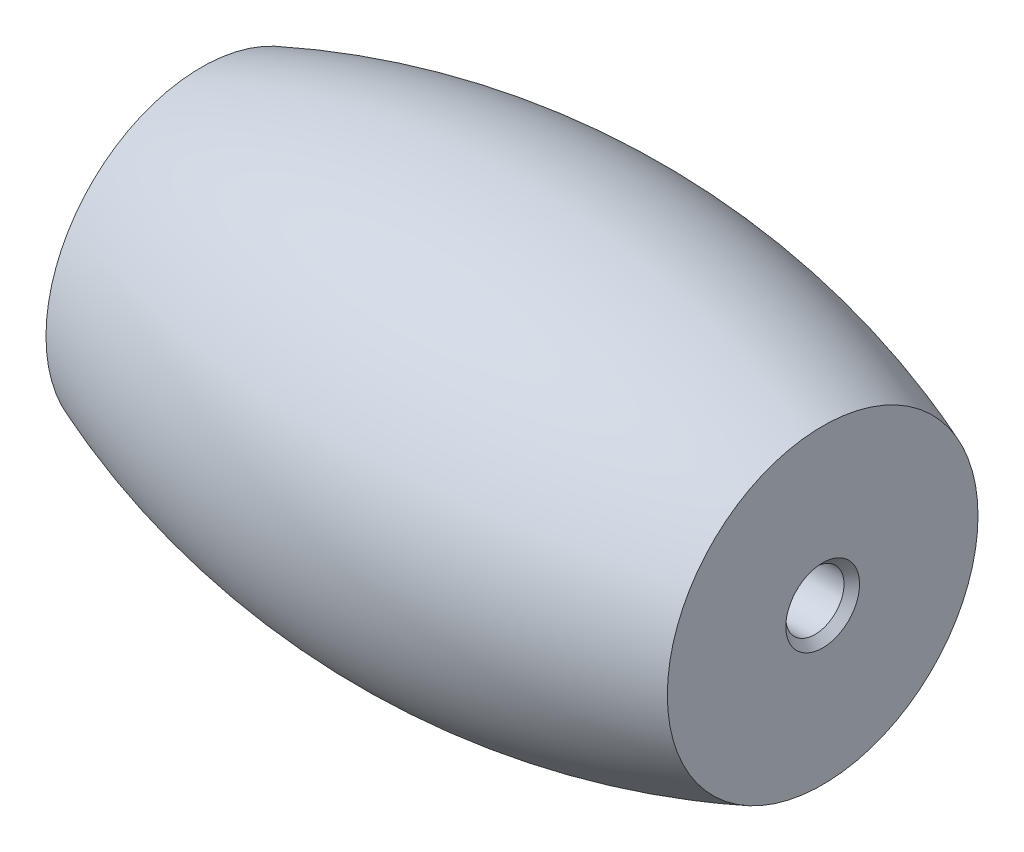
ISO-10303-21;
HEADER;
FILE_DESCRIPTION(('STEP AP214'),'2;1');
FILE_NAME('part.step','',(''),(''),'','','');
FILE_SCHEMA(('AUTOMOTIVE_DESIGN { 1 0 10303 214 1 1 1 1 }'));
ENDSEC;
DATA;
#1=APPLICATION_CONTEXT('core data for automotive mechanical design processes');
#2=APPLICATION_PROTOCOL_DEFINITION('international standard','automotive_design',2000,#1);
#3=PRODUCT_CONTEXT('',#1,'mechanical');
#4=PRODUCT('Part','Part','',(#3));
#5=PRODUCT_RELATED_PRODUCT_CATEGORY('part','',(#4));
#6=PRODUCT_DEFINITION_FORMATION('','',#4);
#7=PRODUCT_DEFINITION_CONTEXT('part definition',#1,'design');
#8=PRODUCT_DEFINITION('design','',#6,#7);
#9=PRODUCT_DEFINITION_SHAPE('','',#8);
#10=(LENGTH_UNIT() NAMED_UNIT(*) SI_UNIT(.MILLI.,.METRE.));
#11=(NAMED_UNIT(*) PLANE_ANGLE_UNIT() SI_UNIT($,.RADIAN.));
#12=(NAMED_UNIT(*) SI_UNIT($,.STERADIAN.) SOLID_ANGLE_UNIT());
#13=UNCERTAINTY_MEASURE_WITH_UNIT(LENGTH_MEASURE(1.E-05),#10,'distance_accuracy_value','');
#14=(GEOMETRIC_REPRESENTATION_CONTEXT(3) GLOBAL_UNCERTAINTY_ASSIGNED_CONTEXT((#13)) GLOBAL_UNIT_ASSIGNED_CONTEXT((#10,
#11,#12)) REPRESENTATION_CONTEXT('',''));
#15=CARTESIAN_POINT('',(0.,0.,0.));
#16=DIRECTION('',(0.,0.,1.));
#17=DIRECTION('',(1.,0.,0.));
#18=AXIS2_PLACEMENT_3D('',#15,#16,#17);
#19=CARTESIAN_POINT('',(0.,16.5797570442413,0.));
#20=DIRECTION('',(-1.,0.,0.));
#21=DIRECTION('',(0.,0.,1.));
#22=AXIS2_PLACEMENT_3D('',#19,#20,#21);
#23=DEGENERATE_TOROIDAL_SURFACE('',#22,16.5797570442413,22.08,.F.);
#24=CARTESIAN_POINT('',(-8.,16.5797570442413,0.));
#25=DIRECTION('',(-1.,0.,0.));
#26=DIRECTION('',(0.,0.,1.));
#27=AXIS2_PLACEMENT_3D('',#24,#25,#26);
#28=CIRCLE('',#27,4.);
#29=CARTESIAN_POINT('',(-8.,16.5797570442413,4.));
#30=VERTEX_POINT('',#29);
#31=EDGE_CURVE('E52',#30,#30,#28,.T.);
#32=ORIENTED_EDGE('',*,*,#31,.F.);
#33=EDGE_LOOP('',(#32));
#34=FACE_BOUND('',#33,.T.);
#35=CARTESIAN_POINT('',(8.,16.5797570442413,0.));
#36=DIRECTION('',(-1.,0.,0.));
#37=DIRECTION('',(0.,0.,1.));
#38=AXIS2_PLACEMENT_3D('',#35,#36,#37);
#39=CIRCLE('',#38,4.);
#40=CARTESIAN_POINT('',(8.,16.5797570442413,4.));
#41=VERTEX_POINT('',#40);
#42=EDGE_CURVE('E55',#41,#41,#39,.T.);
#43=ORIENTED_EDGE('',*,*,#42,.T.);
#44=EDGE_LOOP('',(#43));
#45=FACE_BOUND('',#44,.T.);
#46=ADVANCED_FACE('F32',(#34,#45),#23,.F.);
#47=CARTESIAN_POINT('',(-8.,20.5797570442413,0.));
#48=DIRECTION('',(1.,0.,0.));
#49=DIRECTION('',(0.,0.,-1.));
#50=AXIS2_PLACEMENT_3D('',#47,#48,#49);
#51=PLANE('',#50);
#52=CARTESIAN_POINT('',(-8.,16.5797570442413,0.));
#53=DIRECTION('',(1.,0.,0.));
#54=DIRECTION('',(0.,0.,-1.));
#55=AXIS2_PLACEMENT_3D('',#52,#53,#54);
#56=CIRCLE('',#55,0.95);
#57=CARTESIAN_POINT('',(-8.,16.5797570442413,-0.95));
#58=VERTEX_POINT('',#57);
#59=EDGE_CURVE('E10',#58,#58,#56,.T.);
#60=ORIENTED_EDGE('',*,*,#59,.T.);
#61=EDGE_LOOP('',(#60));
#62=FACE_BOUND('',#61,.T.);
#63=ORIENTED_EDGE('',*,*,#31,.T.);
#64=EDGE_LOOP('',(#63));
#65=FACE_BOUND('',#64,.T.);
#66=ADVANCED_FACE('F63',(#62,#65),#51,.F.);
#67=CARTESIAN_POINT('',(8.,16.5797570442413,0.));
#68=DIRECTION('',(-1.,0.,0.));
#69=DIRECTION('',(0.,0.,1.));
#70=AXIS2_PLACEMENT_3D('',#67,#68,#69);
#71=PLANE('',#70);
#72=CARTESIAN_POINT('',(8.,16.5797570442413,0.));
#73=DIRECTION('',(-1.,0.,0.));
#74=DIRECTION('',(0.,0.,1.));
#75=AXIS2_PLACEMENT_3D('',#72,#73,#74);
#76=CIRCLE('',#75,0.95);
#77=CARTESIAN_POINT('',(8.,16.5797570442413,0.95));
#78=VERTEX_POINT('',#77);
#79=EDGE_CURVE('E39',#78,#78,#76,.T.);
#80=ORIENTED_EDGE('',*,*,#79,.T.);
#81=EDGE_LOOP('',(#80));
#82=FACE_BOUND('',#81,.T.);
#83=ORIENTED_EDGE('',*,*,#42,.F.);
#84=EDGE_LOOP('',(#83));
#85=FACE_BOUND('',#84,.T.);
#86=ADVANCED_FACE('F60',(#82,#85),#71,.F.);
#87=CARTESIAN_POINT('',(10.1213203435596,16.5797570442413,0.));
#88=DIRECTION('',(-1.,0.,0.));
#89=DIRECTION('',(0.,0.,1.));
#90=AXIS2_PLACEMENT_3D('',#87,#88,#89);
#91=CYLINDRICAL_SURFACE('',#90,0.75);
#92=CARTESIAN_POINT('',(7.8,16.5797570442413,0.));
#93=DIRECTION('',(-1.,0.,0.));
#94=DIRECTION('',(0.,0.,1.));
#95=AXIS2_PLACEMENT_3D('',#92,#93,#94);
#96=CIRCLE('',#95,0.75);
#97=CARTESIAN_POINT('',(7.8,16.5797570442413,0.75));
#98=VERTEX_POINT('',#97);
#99=EDGE_CURVE('E43',#98,#98,#96,.F.);
#100=ORIENTED_EDGE('',*,*,#99,.T.);
#101=EDGE_LOOP('',(#100));
#102=FACE_BOUND('',#101,.T.);
#103=CARTESIAN_POINT('',(-7.8,16.5797570442413,0.));
#104=DIRECTION('',(1.,0.,0.));
#105=DIRECTION('',(0.,0.,-1.));
#106=AXIS2_PLACEMENT_3D('',#103,#104,#105);
#107=CIRCLE('',#106,0.75);
#108=CARTESIAN_POINT('',(-7.8,16.5797570442413,-0.75));
#109=VERTEX_POINT('',#108);
#110=EDGE_CURVE('E47',#109,#109,#107,.F.);
#111=ORIENTED_EDGE('',*,*,#110,.T.);
#112=EDGE_LOOP('',(#111));
#113=FACE_BOUND('',#112,.T.);
#114=ADVANCED_FACE('F62',(#102,#113),#91,.F.);
#115=CARTESIAN_POINT('',(7.8,16.5797570442413,0.));
#116=DIRECTION('',(1.,0.,0.));
#117=DIRECTION('',(0.,0.,-1.));
#118=AXIS2_PLACEMENT_3D('',#115,#116,#117);
#119=CONICAL_SURFACE('',#118,0.75,0.785398163397445);
#120=ORIENTED_EDGE('',*,*,#79,.F.);
#121=EDGE_LOOP('',(#120));
#122=FACE_BOUND('',#121,.T.);
#123=ORIENTED_EDGE('',*,*,#99,.F.);
#124=EDGE_LOOP('',(#123));
#125=FACE_BOUND('',#124,.T.);
#126=ADVANCED_FACE('F69',(#122,#125),#119,.F.);
#127=CARTESIAN_POINT('',(-7.8,16.5797570442413,0.));
#128=DIRECTION('',(-1.,0.,0.));
#129=DIRECTION('',(0.,0.,1.));
#130=AXIS2_PLACEMENT_3D('',#127,#128,#129);
#131=CONICAL_SURFACE('',#130,0.75,0.785398163397449);
#132=ORIENTED_EDGE('',*,*,#59,.F.);
#133=EDGE_LOOP('',(#132));
#134=FACE_BOUND('',#133,.T.);
#135=ORIENTED_EDGE('',*,*,#110,.F.);
#136=EDGE_LOOP('',(#135));
#137=FACE_BOUND('',#136,.T.);
#138=ADVANCED_FACE('F34',(#134,#137),#131,.F.);
#139=CLOSED_SHELL('',(#46,#66,#86,#114,#126,#138));
#140=MANIFOLD_SOLID_BREP('B2',#139);
#141=ADVANCED_BREP_SHAPE_REPRESENTATION('',(#18,#140),#14);
#142=SHAPE_DEFINITION_REPRESENTATION(#9,#141);
ENDSEC;
END-ISO-10303-21;
